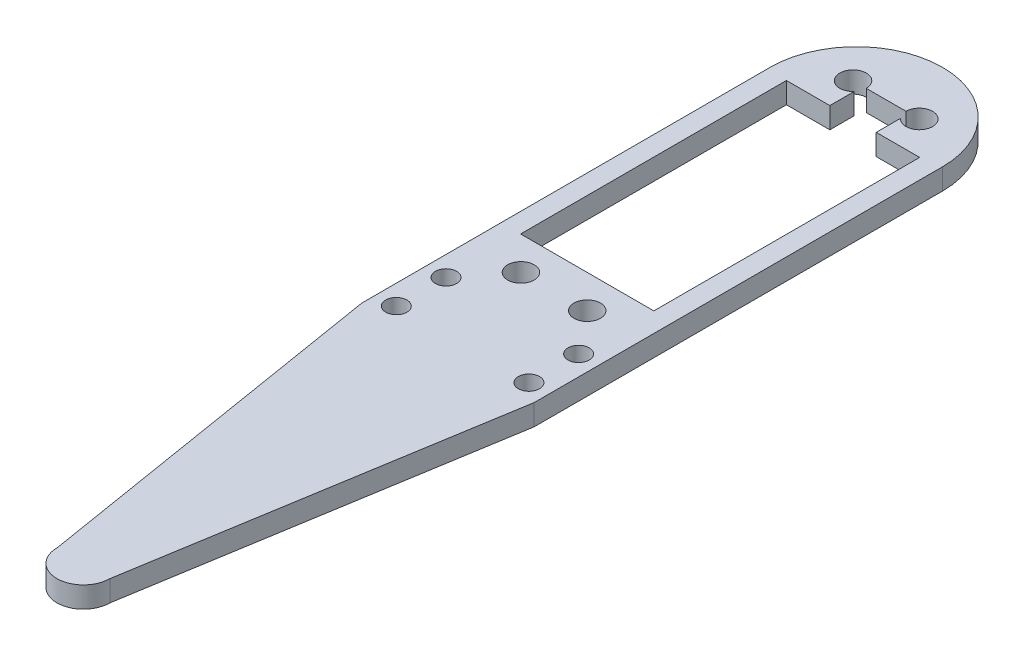
ISO-10303-21;
HEADER;
FILE_DESCRIPTION(('STEP AP214'),'2;1');
FILE_NAME('part.step','',(''),(''),'','','');
FILE_SCHEMA(('AUTOMOTIVE_DESIGN { 1 0 10303 214 1 1 1 1 }'));
ENDSEC;
DATA;
#1=APPLICATION_CONTEXT('core data for automotive mechanical design processes');
#2=APPLICATION_PROTOCOL_DEFINITION('international standard','automotive_design',2000,#1);
#3=PRODUCT_CONTEXT('',#1,'mechanical');
#4=PRODUCT('Part','Part','',(#3));
#5=PRODUCT_RELATED_PRODUCT_CATEGORY('part','',(#4));
#6=PRODUCT_DEFINITION_FORMATION('','',#4);
#7=PRODUCT_DEFINITION_CONTEXT('part definition',#1,'design');
#8=PRODUCT_DEFINITION('design','',#6,#7);
#9=PRODUCT_DEFINITION_SHAPE('','',#8);
#10=(LENGTH_UNIT() NAMED_UNIT(*) SI_UNIT(.MILLI.,.METRE.));
#11=(NAMED_UNIT(*) PLANE_ANGLE_UNIT() SI_UNIT($,.RADIAN.));
#12=(NAMED_UNIT(*) SI_UNIT($,.STERADIAN.) SOLID_ANGLE_UNIT());
#13=UNCERTAINTY_MEASURE_WITH_UNIT(LENGTH_MEASURE(1.E-05),#10,'distance_accuracy_value','');
#14=(GEOMETRIC_REPRESENTATION_CONTEXT(3) GLOBAL_UNCERTAINTY_ASSIGNED_CONTEXT((#13)) GLOBAL_UNIT_ASSIGNED_CONTEXT((#10,
#11,#12)) REPRESENTATION_CONTEXT('',''));
#15=CARTESIAN_POINT('',(0.,0.,0.));
#16=DIRECTION('',(0.,0.,1.));
#17=DIRECTION('',(1.,0.,0.));
#18=AXIS2_PLACEMENT_3D('',#15,#16,#17);
#19=CARTESIAN_POINT('',(-10.05,3.175,0.5));
#20=DIRECTION('',(0.,0.,1.));
#21=DIRECTION('',(1.,0.,0.));
#22=AXIS2_PLACEMENT_3D('',#19,#20,#21);
#23=PLANE('',#22);
#24=DIRECTION('',(0.,1.,0.));
#25=VECTOR('',#24,1.);
#26=CARTESIAN_POINT('',(3.5,-8.60232526704262,0.499999999999998));
#27=LINE('',#26,#25);
#28=CARTESIAN_POINT('',(3.5,0.,0.499999999999998));
#29=VERTEX_POINT('',#28);
#30=CARTESIAN_POINT('',(3.5,3.175,0.499999999999998));
#31=VERTEX_POINT('',#30);
#32=EDGE_CURVE('E143',#29,#31,#27,.T.);
#33=ORIENTED_EDGE('',*,*,#32,.F.);
#34=DIRECTION('',(-1.,0.,0.));
#35=VECTOR('',#34,1.);
#36=CARTESIAN_POINT('',(-10.05,0.,0.5));
#37=LINE('',#36,#35);
#38=CARTESIAN_POINT('',(10.05,0.,0.5));
#39=VERTEX_POINT('',#38);
#40=EDGE_CURVE('E188',#39,#29,#37,.T.);
#41=ORIENTED_EDGE('',*,*,#40,.F.);
#42=DIRECTION('',(0.,-1.,0.));
#43=VECTOR('',#42,1.);
#44=CARTESIAN_POINT('',(10.05,3.175,0.5));
#45=LINE('',#44,#43);
#46=CARTESIAN_POINT('',(10.05,3.175,0.5));
#47=VERTEX_POINT('',#46);
#48=EDGE_CURVE('E170',#47,#39,#45,.T.);
#49=ORIENTED_EDGE('',*,*,#48,.F.);
#50=DIRECTION('',(-1.,0.,0.));
#51=VECTOR('',#50,1.);
#52=CARTESIAN_POINT('',(-10.05,3.175,0.5));
#53=LINE('',#52,#51);
#54=EDGE_CURVE('E162',#47,#31,#53,.T.);
#55=ORIENTED_EDGE('',*,*,#54,.T.);
#56=EDGE_LOOP('',(#33,#41,#49,#55));
#57=FACE_BOUND('',#56,.T.);
#58=ADVANCED_FACE('F32',(#57),#23,.T.);
#59=CARTESIAN_POINT('',(0.,3.175,0.));
#60=DIRECTION('',(0.,1.,0.));
#61=DIRECTION('',(0.,0.,1.));
#62=AXIS2_PLACEMENT_3D('',#59,#60,#61);
#63=PLANE('',#62);
#64=DIRECTION('',(0.,0.,-1.));
#65=VECTOR('',#64,1.);
#66=CARTESIAN_POINT('',(3.5,3.175,-4.5));
#67=LINE('',#66,#65);
#68=CARTESIAN_POINT('',(3.5,3.175,-3.1771243444677));
#69=VERTEX_POINT('',#68);
#70=EDGE_CURVE('E146',#31,#69,#67,.T.);
#71=ORIENTED_EDGE('',*,*,#70,.F.);
#72=ORIENTED_EDGE('',*,*,#54,.F.);
#73=DIRECTION('',(0.,0.,-1.));
#74=VECTOR('',#73,1.);
#75=CARTESIAN_POINT('',(10.05,3.175,0.5));
#76=LINE('',#75,#74);
#77=CARTESIAN_POINT('',(10.05,3.175,40.6));
#78=VERTEX_POINT('',#77);
#79=EDGE_CURVE('E177',#78,#47,#76,.T.);
#80=ORIENTED_EDGE('',*,*,#79,.F.);
#81=DIRECTION('',(1.,0.,0.));
#82=VECTOR('',#81,1.);
#83=CARTESIAN_POINT('',(-10.05,3.175,40.6));
#84=LINE('',#83,#82);
#85=CARTESIAN_POINT('',(-10.05,3.175,40.6));
#86=VERTEX_POINT('',#85);
#87=EDGE_CURVE('E175',#86,#78,#84,.T.);
#88=ORIENTED_EDGE('',*,*,#87,.F.);
#89=DIRECTION('',(0.,0.,1.));
#90=VECTOR('',#89,1.);
#91=CARTESIAN_POINT('',(-10.05,3.175,0.5));
#92=LINE('',#91,#90);
#93=CARTESIAN_POINT('',(-10.05,3.175,0.5));
#94=VERTEX_POINT('',#93);
#95=EDGE_CURVE('E171',#94,#86,#92,.T.);
#96=ORIENTED_EDGE('',*,*,#95,.F.);
#97=CARTESIAN_POINT('',(-3.5,3.175,0.5));
#98=VERTEX_POINT('',#97);
#99=EDGE_CURVE('E172',#98,#94,#53,.T.);
#100=ORIENTED_EDGE('',*,*,#99,.F.);
#101=DIRECTION('',(0.,0.,1.));
#102=VECTOR('',#101,1.);
#103=CARTESIAN_POINT('',(-3.5,3.175,-4.5));
#104=LINE('',#103,#102);
#105=CARTESIAN_POINT('',(-3.5,3.175,-3.1771243444677));
#106=VERTEX_POINT('',#105);
#107=EDGE_CURVE('E47',#106,#98,#104,.T.);
#108=ORIENTED_EDGE('',*,*,#107,.F.);
#109=CARTESIAN_POINT('',(-5.,3.175,-4.5));
#110=DIRECTION('',(0.,1.,0.));
#111=DIRECTION('',(0.,0.,1.));
#112=AXIS2_PLACEMENT_3D('',#109,#110,#111);
#113=CIRCLE('',#112,2.);
#114=CARTESIAN_POINT('',(-3.,3.175,-4.5));
#115=VERTEX_POINT('',#114);
#116=EDGE_CURVE('E211',#115,#106,#113,.T.);
#117=ORIENTED_EDGE('',*,*,#116,.F.);
#118=DIRECTION('',(-1.,0.,0.));
#119=VECTOR('',#118,1.);
#120=CARTESIAN_POINT('',(-3.5,3.175,-4.5));
#121=LINE('',#120,#119);
#122=CARTESIAN_POINT('',(3.,3.175,-4.5));
#123=VERTEX_POINT('',#122);
#124=EDGE_CURVE('E166',#123,#115,#121,.T.);
#125=ORIENTED_EDGE('',*,*,#124,.F.);
#126=CARTESIAN_POINT('',(5.,3.175,-4.5));
#127=DIRECTION('',(0.,1.,0.));
#128=DIRECTION('',(0.,0.,-1.));
#129=AXIS2_PLACEMENT_3D('',#126,#127,#128);
#130=CIRCLE('',#129,2.);
#131=EDGE_CURVE('E165',#69,#123,#130,.T.);
#132=ORIENTED_EDGE('',*,*,#131,.F.);
#133=EDGE_LOOP('',(#71,#72,#80,#88,#96,#100,#108,#117,#125,#132));
#134=FACE_BOUND('',#133,.T.);
#135=CARTESIAN_POINT('',(10.,3.175,51.9));
#136=DIRECTION('',(0.,1.,0.));
#137=DIRECTION('',(0.,0.,1.));
#138=AXIS2_PLACEMENT_3D('',#135,#136,#137);
#139=CIRCLE('',#138,1.6);
#140=CARTESIAN_POINT('',(10.,3.175,53.5));
#141=VERTEX_POINT('',#140);
#142=EDGE_CURVE('E271',#141,#141,#139,.T.);
#143=ORIENTED_EDGE('',*,*,#142,.F.);
#144=EDGE_LOOP('',(#143));
#145=FACE_BOUND('',#144,.T.);
#146=CARTESIAN_POINT('',(-9.99999999999997,3.175,59.4));
#147=DIRECTION('',(0.,1.,0.));
#148=DIRECTION('',(0.,0.,1.));
#149=AXIS2_PLACEMENT_3D('',#146,#147,#148);
#150=CIRCLE('',#149,1.6);
#151=CARTESIAN_POINT('',(-9.99999999999997,3.175,61.));
#152=VERTEX_POINT('',#151);
#153=EDGE_CURVE('E351',#152,#152,#150,.T.);
#154=ORIENTED_EDGE('',*,*,#153,.F.);
#155=EDGE_LOOP('',(#154));
#156=FACE_BOUND('',#155,.T.);
#157=CARTESIAN_POINT('',(-9.99999999999997,3.175,51.9));
#158=DIRECTION('',(0.,1.,0.));
#159=DIRECTION('',(0.,0.,1.));
#160=AXIS2_PLACEMENT_3D('',#157,#158,#159);
#161=CIRCLE('',#160,1.6);
#162=CARTESIAN_POINT('',(-9.99999999999997,3.175,53.5));
#163=VERTEX_POINT('',#162);
#164=EDGE_CURVE('E349',#163,#163,#161,.T.);
#165=ORIENTED_EDGE('',*,*,#164,.F.);
#166=EDGE_LOOP('',(#165));
#167=FACE_BOUND('',#166,.T.);
#168=CARTESIAN_POINT('',(10.,3.175,59.4));
#169=DIRECTION('',(0.,1.,0.));
#170=DIRECTION('',(0.,0.,1.));
#171=AXIS2_PLACEMENT_3D('',#168,#169,#170);
#172=CIRCLE('',#171,1.6);
#173=CARTESIAN_POINT('',(10.,3.175,61.));
#174=VERTEX_POINT('',#173);
#175=EDGE_CURVE('E346',#174,#174,#172,.T.);
#176=ORIENTED_EDGE('',*,*,#175,.F.);
#177=EDGE_LOOP('',(#176));
#178=FACE_BOUND('',#177,.T.);
#179=CARTESIAN_POINT('',(5.,3.175,45.6));
#180=DIRECTION('',(0.,1.,0.));
#181=DIRECTION('',(0.,0.,-1.));
#182=AXIS2_PLACEMENT_3D('',#179,#180,#181);
#183=CIRCLE('',#182,2.);
#184=CARTESIAN_POINT('',(5.,3.175,43.6));
#185=VERTEX_POINT('',#184);
#186=EDGE_CURVE('E187',#185,#185,#183,.T.);
#187=ORIENTED_EDGE('',*,*,#186,.F.);
#188=EDGE_LOOP('',(#187));
#189=FACE_BOUND('',#188,.T.);
#190=CARTESIAN_POINT('',(0.,3.175,0.));
#191=DIRECTION('',(0.,1.,0.));
#192=DIRECTION('',(0.,0.,1.));
#193=AXIS2_PLACEMENT_3D('',#190,#191,#192);
#194=CIRCLE('',#193,13.);
#195=CARTESIAN_POINT('',(13.,3.175,0.));
#196=VERTEX_POINT('',#195);
#197=CARTESIAN_POINT('',(-13.,3.175,0.));
#198=VERTEX_POINT('',#197);
#199=EDGE_CURVE('E217',#196,#198,#194,.T.);
#200=ORIENTED_EDGE('',*,*,#199,.T.);
#201=DIRECTION('',(0.,0.,1.));
#202=VECTOR('',#201,1.);
#203=CARTESIAN_POINT('',(-13.,3.175,0.));
#204=LINE('',#203,#202);
#205=CARTESIAN_POINT('',(-13.,3.175,61.6));
#206=VERTEX_POINT('',#205);
#207=EDGE_CURVE('E220',#198,#206,#204,.T.);
#208=ORIENTED_EDGE('',*,*,#207,.T.);
#209=DIRECTION('',(0.161488568110541,0.,0.986874582897749));
#210=VECTOR('',#209,1.);
#211=CARTESIAN_POINT('',(-13.,3.175,61.6));
#212=LINE('',#211,#210);
#213=CARTESIAN_POINT('',(-3.99999999999998,3.175,116.6));
#214=VERTEX_POINT('',#213);
#215=EDGE_CURVE('E223',#206,#214,#212,.T.);
#216=ORIENTED_EDGE('',*,*,#215,.T.);
#217=CARTESIAN_POINT('',(0.,3.175,116.6));
#218=DIRECTION('',(0.,1.,0.));
#219=DIRECTION('',(0.,0.,1.));
#220=AXIS2_PLACEMENT_3D('',#217,#218,#219);
#221=CIRCLE('',#220,4.);
#222=CARTESIAN_POINT('',(4.00000000000002,3.175,116.6));
#223=VERTEX_POINT('',#222);
#224=EDGE_CURVE('E225',#214,#223,#221,.T.);
#225=ORIENTED_EDGE('',*,*,#224,.T.);
#226=DIRECTION('',(0.16148856811054,0.,-0.98687458289775));
#227=VECTOR('',#226,1.);
#228=CARTESIAN_POINT('',(13.,3.175,61.6));
#229=LINE('',#228,#227);
#230=CARTESIAN_POINT('',(13.,3.175,61.6));
#231=VERTEX_POINT('',#230);
#232=EDGE_CURVE('E227',#223,#231,#229,.T.);
#233=ORIENTED_EDGE('',*,*,#232,.T.);
#234=DIRECTION('',(0.,0.,-1.));
#235=VECTOR('',#234,1.);
#236=CARTESIAN_POINT('',(13.,3.175,0.));
#237=LINE('',#236,#235);
#238=EDGE_CURVE('E229',#231,#196,#237,.T.);
#239=ORIENTED_EDGE('',*,*,#238,.T.);
#240=EDGE_LOOP('',(#200,#208,#216,#225,#233,#239));
#241=FACE_BOUND('',#240,.T.);
#242=CARTESIAN_POINT('',(-5.,3.175,45.6));
#243=DIRECTION('',(0.,1.,0.));
#244=DIRECTION('',(0.,0.,1.));
#245=AXIS2_PLACEMENT_3D('',#242,#243,#244);
#246=CIRCLE('',#245,2.);
#247=CARTESIAN_POINT('',(-5.,3.175,47.6));
#248=VERTEX_POINT('',#247);
#249=EDGE_CURVE('E205',#248,#248,#246,.T.);
#250=ORIENTED_EDGE('',*,*,#249,.F.);
#251=EDGE_LOOP('',(#250));
#252=FACE_BOUND('',#251,.T.);
#253=ADVANCED_FACE('F159',(#134,#145,#156,#167,#178,#189,#241,#252),#63,.T.);
#254=CARTESIAN_POINT('',(0.,0.,0.));
#255=DIRECTION('',(0.,1.,0.));
#256=DIRECTION('',(0.,0.,1.));
#257=AXIS2_PLACEMENT_3D('',#254,#255,#256);
#258=PLANE('',#257);
#259=CARTESIAN_POINT('',(10.,0.,51.9));
#260=DIRECTION('',(0.,1.,0.));
#261=DIRECTION('',(0.,0.,1.));
#262=AXIS2_PLACEMENT_3D('',#259,#260,#261);
#263=CIRCLE('',#262,1.6);
#264=CARTESIAN_POINT('',(10.,0.,53.5));
#265=VERTEX_POINT('',#264);
#266=EDGE_CURVE('E338',#265,#265,#263,.T.);
#267=ORIENTED_EDGE('',*,*,#266,.T.);
#268=EDGE_LOOP('',(#267));
#269=FACE_BOUND('',#268,.T.);
#270=CARTESIAN_POINT('',(-9.99999999999997,0.,59.4));
#271=DIRECTION('',(0.,1.,0.));
#272=DIRECTION('',(0.,0.,1.));
#273=AXIS2_PLACEMENT_3D('',#270,#271,#272);
#274=CIRCLE('',#273,1.6);
#275=CARTESIAN_POINT('',(-9.99999999999997,0.,61.));
#276=VERTEX_POINT('',#275);
#277=EDGE_CURVE('E337',#276,#276,#274,.T.);
#278=ORIENTED_EDGE('',*,*,#277,.T.);
#279=EDGE_LOOP('',(#278));
#280=FACE_BOUND('',#279,.T.);
#281=CARTESIAN_POINT('',(-9.99999999999997,0.,51.9));
#282=DIRECTION('',(0.,1.,0.));
#283=DIRECTION('',(0.,0.,1.));
#284=AXIS2_PLACEMENT_3D('',#281,#282,#283);
#285=CIRCLE('',#284,1.6);
#286=CARTESIAN_POINT('',(-9.99999999999997,0.,53.5));
#287=VERTEX_POINT('',#286);
#288=EDGE_CURVE('E330',#287,#287,#285,.T.);
#289=ORIENTED_EDGE('',*,*,#288,.T.);
#290=EDGE_LOOP('',(#289));
#291=FACE_BOUND('',#290,.T.);
#292=CARTESIAN_POINT('',(10.,0.,59.4));
#293=DIRECTION('',(0.,1.,0.));
#294=DIRECTION('',(0.,0.,1.));
#295=AXIS2_PLACEMENT_3D('',#292,#293,#294);
#296=CIRCLE('',#295,1.6);
#297=CARTESIAN_POINT('',(10.,0.,61.));
#298=VERTEX_POINT('',#297);
#299=EDGE_CURVE('E341',#298,#298,#296,.T.);
#300=ORIENTED_EDGE('',*,*,#299,.T.);
#301=EDGE_LOOP('',(#300));
#302=FACE_BOUND('',#301,.T.);
#303=CARTESIAN_POINT('',(-5.,0.,45.6));
#304=DIRECTION('',(0.,1.,0.));
#305=DIRECTION('',(0.,0.,1.));
#306=AXIS2_PLACEMENT_3D('',#303,#304,#305);
#307=CIRCLE('',#306,2.);
#308=CARTESIAN_POINT('',(-5.,0.,47.6));
#309=VERTEX_POINT('',#308);
#310=EDGE_CURVE('E204',#309,#309,#307,.T.);
#311=ORIENTED_EDGE('',*,*,#310,.T.);
#312=EDGE_LOOP('',(#311));
#313=FACE_BOUND('',#312,.T.);
#314=CARTESIAN_POINT('',(0.,0.,0.));
#315=DIRECTION('',(0.,1.,0.));
#316=DIRECTION('',(0.,0.,1.));
#317=AXIS2_PLACEMENT_3D('',#314,#315,#316);
#318=CIRCLE('',#317,13.);
#319=CARTESIAN_POINT('',(13.,0.,0.));
#320=VERTEX_POINT('',#319);
#321=CARTESIAN_POINT('',(-13.,0.,0.));
#322=VERTEX_POINT('',#321);
#323=EDGE_CURVE('E214',#320,#322,#318,.T.);
#324=ORIENTED_EDGE('',*,*,#323,.F.);
#325=DIRECTION('',(0.,0.,-1.));
#326=VECTOR('',#325,1.);
#327=CARTESIAN_POINT('',(13.,0.,0.));
#328=LINE('',#327,#326);
#329=CARTESIAN_POINT('',(13.,0.,61.6));
#330=VERTEX_POINT('',#329);
#331=EDGE_CURVE('E221',#330,#320,#328,.T.);
#332=ORIENTED_EDGE('',*,*,#331,.F.);
#333=DIRECTION('',(0.16148856811054,0.,-0.98687458289775));
#334=VECTOR('',#333,1.);
#335=CARTESIAN_POINT('',(13.,0.,61.6));
#336=LINE('',#335,#334);
#337=CARTESIAN_POINT('',(4.00000000000002,0.,116.6));
#338=VERTEX_POINT('',#337);
#339=EDGE_CURVE('E240',#338,#330,#336,.T.);
#340=ORIENTED_EDGE('',*,*,#339,.F.);
#341=CARTESIAN_POINT('',(0.,0.,116.6));
#342=DIRECTION('',(0.,1.,0.));
#343=DIRECTION('',(0.,0.,1.));
#344=AXIS2_PLACEMENT_3D('',#341,#342,#343);
#345=CIRCLE('',#344,4.);
#346=CARTESIAN_POINT('',(-3.99999999999998,0.,116.6));
#347=VERTEX_POINT('',#346);
#348=EDGE_CURVE('E238',#347,#338,#345,.T.);
#349=ORIENTED_EDGE('',*,*,#348,.F.);
#350=DIRECTION('',(0.161488568110541,0.,0.986874582897749));
#351=VECTOR('',#350,1.);
#352=CARTESIAN_POINT('',(-13.,0.,61.6));
#353=LINE('',#352,#351);
#354=CARTESIAN_POINT('',(-13.,0.,61.6));
#355=VERTEX_POINT('',#354);
#356=EDGE_CURVE('E236',#355,#347,#353,.T.);
#357=ORIENTED_EDGE('',*,*,#356,.F.);
#358=DIRECTION('',(0.,0.,1.));
#359=VECTOR('',#358,1.);
#360=CARTESIAN_POINT('',(-13.,0.,0.));
#361=LINE('',#360,#359);
#362=EDGE_CURVE('E234',#322,#355,#361,.T.);
#363=ORIENTED_EDGE('',*,*,#362,.F.);
#364=EDGE_LOOP('',(#324,#332,#340,#349,#357,#363));
#365=FACE_BOUND('',#364,.T.);
#366=CARTESIAN_POINT('',(5.,0.,45.6));
#367=DIRECTION('',(0.,1.,0.));
#368=DIRECTION('',(0.,0.,-1.));
#369=AXIS2_PLACEMENT_3D('',#366,#367,#368);
#370=CIRCLE('',#369,2.);
#371=CARTESIAN_POINT('',(5.,0.,43.6));
#372=VERTEX_POINT('',#371);
#373=EDGE_CURVE('E267',#372,#372,#370,.T.);
#374=ORIENTED_EDGE('',*,*,#373,.T.);
#375=EDGE_LOOP('',(#374));
#376=FACE_BOUND('',#375,.T.);
#377=ORIENTED_EDGE('',*,*,#40,.T.);
#378=DIRECTION('',(0.,0.,1.));
#379=VECTOR('',#378,1.);
#380=CARTESIAN_POINT('',(3.5,0.,-4.5));
#381=LINE('',#380,#379);
#382=CARTESIAN_POINT('',(3.5,0.,-3.1771243444677));
#383=VERTEX_POINT('',#382);
#384=EDGE_CURVE('E149',#383,#29,#381,.T.);
#385=ORIENTED_EDGE('',*,*,#384,.F.);
#386=CARTESIAN_POINT('',(5.,0.,-4.5));
#387=DIRECTION('',(0.,1.,0.));
#388=DIRECTION('',(0.,0.,-1.));
#389=AXIS2_PLACEMENT_3D('',#386,#387,#388);
#390=CIRCLE('',#389,2.);
#391=CARTESIAN_POINT('',(3.,0.,-4.5));
#392=VERTEX_POINT('',#391);
#393=EDGE_CURVE('E268',#383,#392,#390,.T.);
#394=ORIENTED_EDGE('',*,*,#393,.T.);
#395=DIRECTION('',(1.,0.,0.));
#396=VECTOR('',#395,1.);
#397=CARTESIAN_POINT('',(-3.5,0.,-4.5));
#398=LINE('',#397,#396);
#399=CARTESIAN_POINT('',(-3.,0.,-4.5));
#400=VERTEX_POINT('',#399);
#401=EDGE_CURVE('E55',#400,#392,#398,.T.);
#402=ORIENTED_EDGE('',*,*,#401,.F.);
#403=CARTESIAN_POINT('',(-5.,0.,-4.5));
#404=DIRECTION('',(0.,1.,0.));
#405=DIRECTION('',(0.,0.,1.));
#406=AXIS2_PLACEMENT_3D('',#403,#404,#405);
#407=CIRCLE('',#406,2.);
#408=CARTESIAN_POINT('',(-3.5,0.,-3.1771243444677));
#409=VERTEX_POINT('',#408);
#410=EDGE_CURVE('E208',#400,#409,#407,.T.);
#411=ORIENTED_EDGE('',*,*,#410,.T.);
#412=DIRECTION('',(0.,0.,-1.));
#413=VECTOR('',#412,1.);
#414=CARTESIAN_POINT('',(-3.5,0.,-4.5));
#415=LINE('',#414,#413);
#416=CARTESIAN_POINT('',(-3.5,0.,0.499999999999998));
#417=VERTEX_POINT('',#416);
#418=EDGE_CURVE('E153',#417,#409,#415,.T.);
#419=ORIENTED_EDGE('',*,*,#418,.F.);
#420=CARTESIAN_POINT('',(-10.05,0.,0.5));
#421=VERTEX_POINT('',#420);
#422=EDGE_CURVE('E186',#417,#421,#37,.T.);
#423=ORIENTED_EDGE('',*,*,#422,.T.);
#424=DIRECTION('',(0.,0.,1.));
#425=VECTOR('',#424,1.);
#426=CARTESIAN_POINT('',(-10.05,0.,0.5));
#427=LINE('',#426,#425);
#428=CARTESIAN_POINT('',(-10.05,0.,40.6));
#429=VERTEX_POINT('',#428);
#430=EDGE_CURVE('E190',#421,#429,#427,.T.);
#431=ORIENTED_EDGE('',*,*,#430,.T.);
#432=DIRECTION('',(1.,0.,0.));
#433=VECTOR('',#432,1.);
#434=CARTESIAN_POINT('',(-10.05,0.,40.6));
#435=LINE('',#434,#433);
#436=CARTESIAN_POINT('',(10.05,0.,40.6));
#437=VERTEX_POINT('',#436);
#438=EDGE_CURVE('E193',#429,#437,#435,.T.);
#439=ORIENTED_EDGE('',*,*,#438,.T.);
#440=DIRECTION('',(0.,0.,-1.));
#441=VECTOR('',#440,1.);
#442=CARTESIAN_POINT('',(10.05,0.,0.5));
#443=LINE('',#442,#441);
#444=EDGE_CURVE('E183',#437,#39,#443,.T.);
#445=ORIENTED_EDGE('',*,*,#444,.T.);
#446=EDGE_LOOP('',(#377,#385,#394,#402,#411,#419,#423,#431,#439,#445));
#447=FACE_BOUND('',#446,.T.);
#448=ADVANCED_FACE('F284',(#269,#280,#291,#302,#313,#365,#376,#447),#258,.F.);
#449=CARTESIAN_POINT('',(0.,3.175,0.));
#450=DIRECTION('',(0.,-1.,0.));
#451=DIRECTION('',(0.,0.,-1.));
#452=AXIS2_PLACEMENT_3D('',#449,#450,#451);
#453=CYLINDRICAL_SURFACE('',#452,13.);
#454=ORIENTED_EDGE('',*,*,#323,.T.);
#455=DIRECTION('',(0.,-1.,0.));
#456=VECTOR('',#455,1.);
#457=CARTESIAN_POINT('',(-13.,3.175,0.));
#458=LINE('',#457,#456);
#459=EDGE_CURVE('E257',#198,#322,#458,.T.);
#460=ORIENTED_EDGE('',*,*,#459,.F.);
#461=ORIENTED_EDGE('',*,*,#199,.F.);
#462=DIRECTION('',(0.,-1.,0.));
#463=VECTOR('',#462,1.);
#464=CARTESIAN_POINT('',(13.,3.175,0.));
#465=LINE('',#464,#463);
#466=EDGE_CURVE('E231',#196,#320,#465,.T.);
#467=ORIENTED_EDGE('',*,*,#466,.T.);
#468=EDGE_LOOP('',(#454,#460,#461,#467));
#469=FACE_BOUND('',#468,.T.);
#470=ADVANCED_FACE('F34',(#469),#453,.T.);
#471=CARTESIAN_POINT('',(-13.,3.175,0.));
#472=DIRECTION('',(1.,0.,0.));
#473=DIRECTION('',(0.,0.,-1.));
#474=AXIS2_PLACEMENT_3D('',#471,#472,#473);
#475=PLANE('',#474);
#476=ORIENTED_EDGE('',*,*,#362,.T.);
#477=DIRECTION('',(0.,-1.,0.));
#478=VECTOR('',#477,1.);
#479=CARTESIAN_POINT('',(-13.,3.175,61.6));
#480=LINE('',#479,#478);
#481=EDGE_CURVE('E254',#206,#355,#480,.T.);
#482=ORIENTED_EDGE('',*,*,#481,.F.);
#483=ORIENTED_EDGE('',*,*,#207,.F.);
#484=ORIENTED_EDGE('',*,*,#459,.T.);
#485=EDGE_LOOP('',(#476,#482,#483,#484));
#486=FACE_BOUND('',#485,.T.);
#487=ADVANCED_FACE('F412',(#486),#475,.F.);
#488=CARTESIAN_POINT('',(-13.,3.175,61.6));
#489=DIRECTION('',(0.98687458289775,0.,-0.161488568110541));
#490=DIRECTION('',(-0.161488568110541,0.,-0.98687458289775));
#491=AXIS2_PLACEMENT_3D('',#488,#489,#490);
#492=PLANE('',#491);
#493=ORIENTED_EDGE('',*,*,#356,.T.);
#494=DIRECTION('',(0.,-1.,0.));
#495=VECTOR('',#494,1.);
#496=CARTESIAN_POINT('',(-3.99999999999998,3.175,116.6));
#497=LINE('',#496,#495);
#498=EDGE_CURVE('E251',#214,#347,#497,.T.);
#499=ORIENTED_EDGE('',*,*,#498,.F.);
#500=ORIENTED_EDGE('',*,*,#215,.F.);
#501=ORIENTED_EDGE('',*,*,#481,.T.);
#502=EDGE_LOOP('',(#493,#499,#500,#501));
#503=FACE_BOUND('',#502,.T.);
#504=ADVANCED_FACE('F409',(#503),#492,.F.);
#505=CARTESIAN_POINT('',(0.,3.175,116.6));
#506=DIRECTION('',(0.,-1.,0.));
#507=DIRECTION('',(0.,0.,-1.));
#508=AXIS2_PLACEMENT_3D('',#505,#506,#507);
#509=CYLINDRICAL_SURFACE('',#508,4.);
#510=ORIENTED_EDGE('',*,*,#348,.T.);
#511=DIRECTION('',(0.,-1.,0.));
#512=VECTOR('',#511,1.);
#513=CARTESIAN_POINT('',(4.00000000000002,3.175,116.6));
#514=LINE('',#513,#512);
#515=EDGE_CURVE('E248',#223,#338,#514,.T.);
#516=ORIENTED_EDGE('',*,*,#515,.F.);
#517=ORIENTED_EDGE('',*,*,#224,.F.);
#518=ORIENTED_EDGE('',*,*,#498,.T.);
#519=EDGE_LOOP('',(#510,#516,#517,#518));
#520=FACE_BOUND('',#519,.T.);
#521=ADVANCED_FACE('F405',(#520),#509,.T.);
#522=CARTESIAN_POINT('',(13.,3.175,61.6));
#523=DIRECTION('',(-0.98687458289775,0.,-0.16148856811054));
#524=DIRECTION('',(-0.16148856811054,0.,0.98687458289775));
#525=AXIS2_PLACEMENT_3D('',#522,#523,#524);
#526=PLANE('',#525);
#527=ORIENTED_EDGE('',*,*,#339,.T.);
#528=DIRECTION('',(0.,-1.,0.));
#529=VECTOR('',#528,1.);
#530=CARTESIAN_POINT('',(13.,3.175,61.6));
#531=LINE('',#530,#529);
#532=EDGE_CURVE('E245',#231,#330,#531,.T.);
#533=ORIENTED_EDGE('',*,*,#532,.F.);
#534=ORIENTED_EDGE('',*,*,#232,.F.);
#535=ORIENTED_EDGE('',*,*,#515,.T.);
#536=EDGE_LOOP('',(#527,#533,#534,#535));
#537=FACE_BOUND('',#536,.T.);
#538=ADVANCED_FACE('F401',(#537),#526,.F.);
#539=CARTESIAN_POINT('',(13.,3.175,0.));
#540=DIRECTION('',(-1.,0.,0.));
#541=DIRECTION('',(0.,0.,1.));
#542=AXIS2_PLACEMENT_3D('',#539,#540,#541);
#543=PLANE('',#542);
#544=ORIENTED_EDGE('',*,*,#331,.T.);
#545=ORIENTED_EDGE('',*,*,#466,.F.);
#546=ORIENTED_EDGE('',*,*,#238,.F.);
#547=ORIENTED_EDGE('',*,*,#532,.T.);
#548=EDGE_LOOP('',(#544,#545,#546,#547));
#549=FACE_BOUND('',#548,.T.);
#550=ADVANCED_FACE('F397',(#549),#543,.F.);
#551=CARTESIAN_POINT('',(-5.,3.175,-4.5));
#552=DIRECTION('',(0.,-1.,0.));
#553=DIRECTION('',(0.,0.,-1.));
#554=AXIS2_PLACEMENT_3D('',#551,#552,#553);
#555=CYLINDRICAL_SURFACE('',#554,2.);
#556=DIRECTION('',(0.,-1.,0.));
#557=VECTOR('',#556,1.);
#558=CARTESIAN_POINT('',(-3.5,3.175,-3.1771243444677));
#559=LINE('',#558,#557);
#560=EDGE_CURVE('E327',#409,#106,#559,.F.);
#561=ORIENTED_EDGE('',*,*,#560,.F.);
#562=ORIENTED_EDGE('',*,*,#410,.F.);
#563=DIRECTION('',(0.,-1.,0.));
#564=VECTOR('',#563,1.);
#565=CARTESIAN_POINT('',(-3.,3.175,-4.5));
#566=LINE('',#565,#564);
#567=EDGE_CURVE('E328',#115,#400,#566,.T.);
#568=ORIENTED_EDGE('',*,*,#567,.F.);
#569=ORIENTED_EDGE('',*,*,#116,.T.);
#570=EDGE_LOOP('',(#561,#562,#568,#569));
#571=FACE_BOUND('',#570,.T.);
#572=ADVANCED_FACE('F295',(#571),#555,.F.);
#573=CARTESIAN_POINT('',(-5.,3.175,45.6));
#574=DIRECTION('',(0.,-1.,0.));
#575=DIRECTION('',(0.,0.,-1.));
#576=AXIS2_PLACEMENT_3D('',#573,#574,#575);
#577=CYLINDRICAL_SURFACE('',#576,2.);
#578=ORIENTED_EDGE('',*,*,#249,.T.);
#579=EDGE_LOOP('',(#578));
#580=FACE_BOUND('',#579,.T.);
#581=ORIENTED_EDGE('',*,*,#310,.F.);
#582=EDGE_LOOP('',(#581));
#583=FACE_BOUND('',#582,.T.);
#584=ADVANCED_FACE('F291',(#580,#583),#577,.F.);
#585=CARTESIAN_POINT('',(10.05,3.175,0.5));
#586=DIRECTION('',(-1.,0.,0.));
#587=DIRECTION('',(0.,0.,1.));
#588=AXIS2_PLACEMENT_3D('',#585,#586,#587);
#589=PLANE('',#588);
#590=ORIENTED_EDGE('',*,*,#444,.F.);
#591=DIRECTION('',(0.,-1.,0.));
#592=VECTOR('',#591,1.);
#593=CARTESIAN_POINT('',(10.05,3.175,40.6));
#594=LINE('',#593,#592);
#595=EDGE_CURVE('E182',#78,#437,#594,.T.);
#596=ORIENTED_EDGE('',*,*,#595,.F.);
#597=ORIENTED_EDGE('',*,*,#79,.T.);
#598=ORIENTED_EDGE('',*,*,#48,.T.);
#599=EDGE_LOOP('',(#590,#596,#597,#598));
#600=FACE_BOUND('',#599,.T.);
#601=ADVANCED_FACE('F294',(#600),#589,.T.);
#602=DIRECTION('',(0.,1.,0.));
#603=VECTOR('',#602,1.);
#604=CARTESIAN_POINT('',(-3.5,-8.60232526704262,0.499999999999998));
#605=LINE('',#604,#603);
#606=EDGE_CURVE('E154',#417,#98,#605,.T.);
#607=ORIENTED_EDGE('',*,*,#606,.T.);
#608=ORIENTED_EDGE('',*,*,#99,.T.);
#609=DIRECTION('',(0.,-1.,0.));
#610=VECTOR('',#609,1.);
#611=CARTESIAN_POINT('',(-10.05,3.175,0.5));
#612=LINE('',#611,#610);
#613=EDGE_CURVE('E200',#94,#421,#612,.T.);
#614=ORIENTED_EDGE('',*,*,#613,.T.);
#615=ORIENTED_EDGE('',*,*,#422,.F.);
#616=EDGE_LOOP('',(#607,#608,#614,#615));
#617=FACE_BOUND('',#616,.T.);
#618=ADVANCED_FACE('F322',(#617),#23,.T.);
#619=CARTESIAN_POINT('',(-10.05,3.175,0.5));
#620=DIRECTION('',(1.,0.,0.));
#621=DIRECTION('',(0.,0.,-1.));
#622=AXIS2_PLACEMENT_3D('',#619,#620,#621);
#623=PLANE('',#622);
#624=ORIENTED_EDGE('',*,*,#430,.F.);
#625=ORIENTED_EDGE('',*,*,#613,.F.);
#626=ORIENTED_EDGE('',*,*,#95,.T.);
#627=DIRECTION('',(0.,-1.,0.));
#628=VECTOR('',#627,1.);
#629=CARTESIAN_POINT('',(-10.05,3.175,40.6));
#630=LINE('',#629,#628);
#631=EDGE_CURVE('E198',#86,#429,#630,.T.);
#632=ORIENTED_EDGE('',*,*,#631,.T.);
#633=EDGE_LOOP('',(#624,#625,#626,#632));
#634=FACE_BOUND('',#633,.T.);
#635=ADVANCED_FACE('F319',(#634),#623,.T.);
#636=CARTESIAN_POINT('',(-10.05,3.175,40.6));
#637=DIRECTION('',(0.,0.,-1.));
#638=DIRECTION('',(-1.,0.,0.));
#639=AXIS2_PLACEMENT_3D('',#636,#637,#638);
#640=PLANE('',#639);
#641=ORIENTED_EDGE('',*,*,#438,.F.);
#642=ORIENTED_EDGE('',*,*,#631,.F.);
#643=ORIENTED_EDGE('',*,*,#87,.T.);
#644=ORIENTED_EDGE('',*,*,#595,.T.);
#645=EDGE_LOOP('',(#641,#642,#643,#644));
#646=FACE_BOUND('',#645,.T.);
#647=ADVANCED_FACE('F315',(#646),#640,.T.);
#648=CARTESIAN_POINT('',(5.,3.175,45.6));
#649=DIRECTION('',(0.,-1.,0.));
#650=DIRECTION('',(0.,0.,-1.));
#651=AXIS2_PLACEMENT_3D('',#648,#649,#650);
#652=CYLINDRICAL_SURFACE('',#651,2.);
#653=ORIENTED_EDGE('',*,*,#186,.T.);
#654=EDGE_LOOP('',(#653));
#655=FACE_BOUND('',#654,.T.);
#656=ORIENTED_EDGE('',*,*,#373,.F.);
#657=EDGE_LOOP('',(#656));
#658=FACE_BOUND('',#657,.T.);
#659=ADVANCED_FACE('F279',(#655,#658),#652,.F.);
#660=CARTESIAN_POINT('',(5.,3.175,-4.5));
#661=DIRECTION('',(0.,-1.,0.));
#662=DIRECTION('',(0.,0.,-1.));
#663=AXIS2_PLACEMENT_3D('',#660,#661,#662);
#664=CYLINDRICAL_SURFACE('',#663,2.);
#665=DIRECTION('',(0.,-1.,0.));
#666=VECTOR('',#665,1.);
#667=CARTESIAN_POINT('',(3.5,3.175,-3.1771243444677));
#668=LINE('',#667,#666);
#669=EDGE_CURVE('E11',#69,#383,#668,.T.);
#670=ORIENTED_EDGE('',*,*,#669,.F.);
#671=ORIENTED_EDGE('',*,*,#131,.T.);
#672=DIRECTION('',(0.,-1.,0.));
#673=VECTOR('',#672,1.);
#674=CARTESIAN_POINT('',(3.,3.175,-4.5));
#675=LINE('',#674,#673);
#676=EDGE_CURVE('E40',#392,#123,#675,.F.);
#677=ORIENTED_EDGE('',*,*,#676,.F.);
#678=ORIENTED_EDGE('',*,*,#393,.F.);
#679=EDGE_LOOP('',(#670,#671,#677,#678));
#680=FACE_BOUND('',#679,.T.);
#681=ADVANCED_FACE('F266',(#680),#664,.F.);
#682=CARTESIAN_POINT('',(10.,0.,59.4));
#683=DIRECTION('',(0.,1.,0.));
#684=DIRECTION('',(0.,0.,1.));
#685=AXIS2_PLACEMENT_3D('',#682,#683,#684);
#686=CYLINDRICAL_SURFACE('',#685,1.6);
#687=ORIENTED_EDGE('',*,*,#175,.T.);
#688=EDGE_LOOP('',(#687));
#689=FACE_BOUND('',#688,.T.);
#690=ORIENTED_EDGE('',*,*,#299,.F.);
#691=EDGE_LOOP('',(#690));
#692=FACE_BOUND('',#691,.T.);
#693=ADVANCED_FACE('F366',(#689,#692),#686,.F.);
#694=CARTESIAN_POINT('',(-9.99999999999997,0.,51.9));
#695=DIRECTION('',(0.,1.,0.));
#696=DIRECTION('',(0.,0.,1.));
#697=AXIS2_PLACEMENT_3D('',#694,#695,#696);
#698=CYLINDRICAL_SURFACE('',#697,1.6);
#699=ORIENTED_EDGE('',*,*,#164,.T.);
#700=EDGE_LOOP('',(#699));
#701=FACE_BOUND('',#700,.T.);
#702=ORIENTED_EDGE('',*,*,#288,.F.);
#703=EDGE_LOOP('',(#702));
#704=FACE_BOUND('',#703,.T.);
#705=ADVANCED_FACE('F369',(#701,#704),#698,.F.);
#706=CARTESIAN_POINT('',(-9.99999999999997,0.,59.4));
#707=DIRECTION('',(0.,1.,0.));
#708=DIRECTION('',(0.,0.,1.));
#709=AXIS2_PLACEMENT_3D('',#706,#707,#708);
#710=CYLINDRICAL_SURFACE('',#709,1.6);
#711=ORIENTED_EDGE('',*,*,#153,.T.);
#712=EDGE_LOOP('',(#711));
#713=FACE_BOUND('',#712,.T.);
#714=ORIENTED_EDGE('',*,*,#277,.F.);
#715=EDGE_LOOP('',(#714));
#716=FACE_BOUND('',#715,.T.);
#717=ADVANCED_FACE('F377',(#713,#716),#710,.F.);
#718=CARTESIAN_POINT('',(10.,0.,51.9));
#719=DIRECTION('',(0.,1.,0.));
#720=DIRECTION('',(0.,0.,1.));
#721=AXIS2_PLACEMENT_3D('',#718,#719,#720);
#722=CYLINDRICAL_SURFACE('',#721,1.6);
#723=ORIENTED_EDGE('',*,*,#142,.T.);
#724=EDGE_LOOP('',(#723));
#725=FACE_BOUND('',#724,.T.);
#726=ORIENTED_EDGE('',*,*,#266,.F.);
#727=EDGE_LOOP('',(#726));
#728=FACE_BOUND('',#727,.T.);
#729=ADVANCED_FACE('F358',(#725,#728),#722,.F.);
#730=CARTESIAN_POINT('',(-3.5,-8.60232526704262,-4.5));
#731=DIRECTION('',(0.,0.,-1.));
#732=DIRECTION('',(-1.,0.,0.));
#733=AXIS2_PLACEMENT_3D('',#730,#731,#732);
#734=PLANE('',#733);
#735=ORIENTED_EDGE('',*,*,#567,.T.);
#736=ORIENTED_EDGE('',*,*,#401,.T.);
#737=ORIENTED_EDGE('',*,*,#676,.T.);
#738=ORIENTED_EDGE('',*,*,#124,.T.);
#739=EDGE_LOOP('',(#735,#736,#737,#738));
#740=FACE_BOUND('',#739,.T.);
#741=ADVANCED_FACE('F259',(#740),#734,.F.);
#742=CARTESIAN_POINT('',(3.5,-8.60232526704262,-4.5));
#743=DIRECTION('',(1.,0.,0.));
#744=DIRECTION('',(0.,0.,-1.));
#745=AXIS2_PLACEMENT_3D('',#742,#743,#744);
#746=PLANE('',#745);
#747=ORIENTED_EDGE('',*,*,#669,.T.);
#748=ORIENTED_EDGE('',*,*,#384,.T.);
#749=ORIENTED_EDGE('',*,*,#32,.T.);
#750=ORIENTED_EDGE('',*,*,#70,.T.);
#751=EDGE_LOOP('',(#747,#748,#749,#750));
#752=FACE_BOUND('',#751,.T.);
#753=ADVANCED_FACE('F145',(#752),#746,.F.);
#754=CARTESIAN_POINT('',(-3.5,-8.60232526704262,-4.5));
#755=DIRECTION('',(-1.,0.,0.));
#756=DIRECTION('',(0.,0.,1.));
#757=AXIS2_PLACEMENT_3D('',#754,#755,#756);
#758=PLANE('',#757);
#759=ORIENTED_EDGE('',*,*,#560,.T.);
#760=ORIENTED_EDGE('',*,*,#107,.T.);
#761=ORIENTED_EDGE('',*,*,#606,.F.);
#762=ORIENTED_EDGE('',*,*,#418,.T.);
#763=EDGE_LOOP('',(#759,#760,#761,#762));
#764=FACE_BOUND('',#763,.T.);
#765=ADVANCED_FACE('F568',(#764),#758,.F.);
#766=CLOSED_SHELL('',(#58,#253,#448,#470,#487,#504,#521,#538,#550,#572,#584,#601,#618,#635,#647,
#659,#681,#693,#705,#717,#729,#741,#753,#765));
#767=MANIFOLD_SOLID_BREP('B2',#766);
#768=ADVANCED_BREP_SHAPE_REPRESENTATION('',(#18,#767),#14);
#769=SHAPE_DEFINITION_REPRESENTATION(#9,#768);
ENDSEC;
END-ISO-10303-21;
